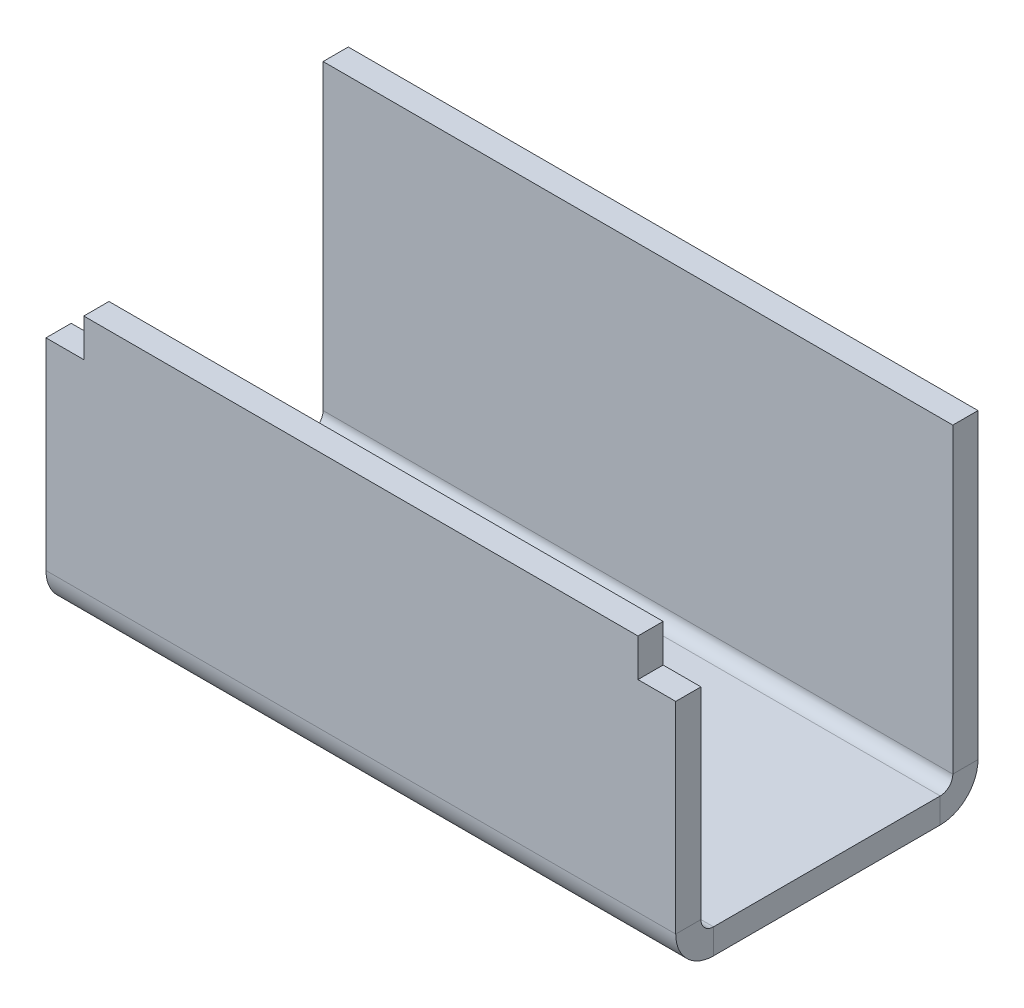
ISO-10303-21;
HEADER;
FILE_DESCRIPTION(('STEP AP214'),'2;1');
FILE_NAME('part.step','',(''),(''),'','','');
FILE_SCHEMA(('AUTOMOTIVE_DESIGN { 1 0 10303 214 1 1 1 1 }'));
ENDSEC;
DATA;
#1=APPLICATION_CONTEXT('core data for automotive mechanical design processes');
#2=APPLICATION_PROTOCOL_DEFINITION('international standard','automotive_design',2000,#1);
#3=PRODUCT_CONTEXT('',#1,'mechanical');
#4=PRODUCT('Part','Part','',(#3));
#5=PRODUCT_RELATED_PRODUCT_CATEGORY('part','',(#4));
#6=PRODUCT_DEFINITION_FORMATION('','',#4);
#7=PRODUCT_DEFINITION_CONTEXT('part definition',#1,'design');
#8=PRODUCT_DEFINITION('design','',#6,#7);
#9=PRODUCT_DEFINITION_SHAPE('','',#8);
#10=(LENGTH_UNIT() NAMED_UNIT(*) SI_UNIT(.MILLI.,.METRE.));
#11=(NAMED_UNIT(*) PLANE_ANGLE_UNIT() SI_UNIT($,.RADIAN.));
#12=(NAMED_UNIT(*) SI_UNIT($,.STERADIAN.) SOLID_ANGLE_UNIT());
#13=UNCERTAINTY_MEASURE_WITH_UNIT(LENGTH_MEASURE(1.E-05),#10,'distance_accuracy_value','');
#14=(GEOMETRIC_REPRESENTATION_CONTEXT(3) GLOBAL_UNCERTAINTY_ASSIGNED_CONTEXT((#13)) GLOBAL_UNIT_ASSIGNED_CONTEXT((#10,
#11,#12)) REPRESENTATION_CONTEXT('',''));
#15=CARTESIAN_POINT('',(0.,0.,0.));
#16=DIRECTION('',(0.,0.,1.));
#17=DIRECTION('',(1.,0.,0.));
#18=AXIS2_PLACEMENT_3D('',#15,#16,#17);
#19=CARTESIAN_POINT('',(4.92013E-12,-0.07421739130408,-0.02));
#20=DIRECTION('',(0.,0.,1.));
#21=DIRECTION('',(0.,-1.,0.));
#22=AXIS2_PLACEMENT_3D('',#19,#20,#21);
#23=PLANE('',#22);
#24=DIRECTION('',(1.,0.,0.));
#25=VECTOR('',#24,1.);
#26=CARTESIAN_POINT('',(-0.249999999995,0.01,-0.02));
#27=LINE('',#26,#25);
#28=CARTESIAN_POINT('',(-0.249999999995,0.01,-0.02));
#29=VERTEX_POINT('',#28);
#30=CARTESIAN_POINT('',(0.250000000005,0.01,-0.02));
#31=VERTEX_POINT('',#30);
#32=EDGE_CURVE('E246',#29,#31,#27,.T.);
#33=ORIENTED_EDGE('',*,*,#32,.F.);
#34=DIRECTION('',(0.,1.,0.));
#35=VECTOR('',#34,1.);
#36=CARTESIAN_POINT('',(-0.249999999995,-0.37,-0.02));
#37=LINE('',#36,#35);
#38=CARTESIAN_POINT('',(-0.249999999995,0.25,-0.02));
#39=VERTEX_POINT('',#38);
#40=EDGE_CURVE('E20',#29,#39,#37,.T.);
#41=ORIENTED_EDGE('',*,*,#40,.T.);
#42=DIRECTION('',(1.,0.,0.));
#43=VECTOR('',#42,1.);
#44=CARTESIAN_POINT('',(-0.249999999995,0.25,-0.02));
#45=LINE('',#44,#43);
#46=CARTESIAN_POINT('',(0.250000000005,0.25,-0.02));
#47=VERTEX_POINT('',#46);
#48=EDGE_CURVE('E11',#39,#47,#45,.T.);
#49=ORIENTED_EDGE('',*,*,#48,.T.);
#50=DIRECTION('',(0.,-1.,0.));
#51=VECTOR('',#50,1.);
#52=CARTESIAN_POINT('',(0.250000000005,0.25,-0.02));
#53=LINE('',#52,#51);
#54=EDGE_CURVE('E254',#47,#31,#53,.T.);
#55=ORIENTED_EDGE('',*,*,#54,.T.);
#56=EDGE_LOOP('',(#33,#41,#49,#55));
#57=FACE_BOUND('',#56,.T.);
#58=ADVANCED_FACE('F17',(#57),#23,.F.);
#59=CARTESIAN_POINT('',(-0.249999999995,0.25,0.));
#60=DIRECTION('',(0.,-1.,0.));
#61=DIRECTION('',(0.,0.,-1.));
#62=AXIS2_PLACEMENT_3D('',#59,#60,#61);
#63=PLANE('',#62);
#64=DIRECTION('',(0.,0.,-1.));
#65=VECTOR('',#64,1.);
#66=CARTESIAN_POINT('',(-0.249999999995,0.25,0.));
#67=LINE('',#66,#65);
#68=CARTESIAN_POINT('',(-0.249999999995,0.25,0.));
#69=VERTEX_POINT('',#68);
#70=EDGE_CURVE('E299',#69,#39,#67,.T.);
#71=ORIENTED_EDGE('',*,*,#70,.F.);
#72=DIRECTION('',(1.,0.,0.));
#73=VECTOR('',#72,1.);
#74=CARTESIAN_POINT('',(-0.249999999995,0.25,0.));
#75=LINE('',#74,#73);
#76=CARTESIAN_POINT('',(0.250000000005,0.25,0.));
#77=VERTEX_POINT('',#76);
#78=EDGE_CURVE('E247',#69,#77,#75,.T.);
#79=ORIENTED_EDGE('',*,*,#78,.T.);
#80=DIRECTION('',(0.,0.,-1.));
#81=VECTOR('',#80,1.);
#82=CARTESIAN_POINT('',(0.250000000005,0.25,0.));
#83=LINE('',#82,#81);
#84=EDGE_CURVE('E257',#77,#47,#83,.T.);
#85=ORIENTED_EDGE('',*,*,#84,.T.);
#86=ORIENTED_EDGE('',*,*,#48,.F.);
#87=EDGE_LOOP('',(#71,#79,#85,#86));
#88=FACE_BOUND('',#87,.T.);
#89=ADVANCED_FACE('F472',(#88),#63,.F.);
#90=CARTESIAN_POINT('',(-0.249999999995,-0.37,0.));
#91=DIRECTION('',(1.,0.,0.));
#92=DIRECTION('',(0.,1.,0.));
#93=AXIS2_PLACEMENT_3D('',#90,#91,#92);
#94=PLANE('',#93);
#95=DIRECTION('',(0.,1.,0.));
#96=VECTOR('',#95,1.);
#97=CARTESIAN_POINT('',(-0.249999999995,-0.37,0.));
#98=LINE('',#97,#96);
#99=CARTESIAN_POINT('',(-0.249999999995,0.01,0.));
#100=VERTEX_POINT('',#99);
#101=EDGE_CURVE('E239',#100,#69,#98,.T.);
#102=ORIENTED_EDGE('',*,*,#101,.T.);
#103=ORIENTED_EDGE('',*,*,#70,.T.);
#104=ORIENTED_EDGE('',*,*,#40,.F.);
#105=DIRECTION('',(0.,0.,-1.));
#106=VECTOR('',#105,1.);
#107=CARTESIAN_POINT('',(-0.249999999995,0.01,0.));
#108=LINE('',#107,#106);
#109=EDGE_CURVE('E281',#100,#29,#108,.T.);
#110=ORIENTED_EDGE('',*,*,#109,.F.);
#111=EDGE_LOOP('',(#102,#103,#104,#110));
#112=FACE_BOUND('',#111,.T.);
#113=ADVANCED_FACE('F309',(#112),#94,.F.);
#114=CARTESIAN_POINT('',(0.250000000005,0.25,0.));
#115=DIRECTION('',(-1.,0.,0.));
#116=DIRECTION('',(0.,0.,1.));
#117=AXIS2_PLACEMENT_3D('',#114,#115,#116);
#118=PLANE('',#117);
#119=DIRECTION('',(0.,-1.,0.));
#120=VECTOR('',#119,1.);
#121=CARTESIAN_POINT('',(0.250000000005,0.25,0.));
#122=LINE('',#121,#120);
#123=CARTESIAN_POINT('',(0.250000000005,0.01,0.));
#124=VERTEX_POINT('',#123);
#125=EDGE_CURVE('E289',#77,#124,#122,.T.);
#126=ORIENTED_EDGE('',*,*,#125,.T.);
#127=DIRECTION('',(0.,0.,-1.));
#128=VECTOR('',#127,1.);
#129=CARTESIAN_POINT('',(0.250000000005,0.01,0.));
#130=LINE('',#129,#128);
#131=EDGE_CURVE('E280',#124,#31,#130,.T.);
#132=ORIENTED_EDGE('',*,*,#131,.T.);
#133=ORIENTED_EDGE('',*,*,#54,.F.);
#134=ORIENTED_EDGE('',*,*,#84,.F.);
#135=EDGE_LOOP('',(#126,#132,#133,#134));
#136=FACE_BOUND('',#135,.T.);
#137=ADVANCED_FACE('F470',(#136),#118,.F.);
#138=CARTESIAN_POINT('',(-0.249999999995,0.01,0.01));
#139=DIRECTION('',(1.,0.,0.));
#140=DIRECTION('',(0.,0.,1.));
#141=AXIS2_PLACEMENT_3D('',#138,#139,#140);
#142=CYLINDRICAL_SURFACE('',#141,0.03);
#143=DIRECTION('',(-1.,0.,0.));
#144=VECTOR('',#143,1.);
#145=CARTESIAN_POINT('',(-0.249999999995,-0.02,0.01));
#146=LINE('',#145,#144);
#147=CARTESIAN_POINT('',(0.250000000005,-0.02,0.01));
#148=VERTEX_POINT('',#147);
#149=CARTESIAN_POINT('',(-0.249999999995,-0.02,0.01));
#150=VERTEX_POINT('',#149);
#151=EDGE_CURVE('E273',#148,#150,#146,.T.);
#152=ORIENTED_EDGE('',*,*,#151,.T.);
#153=CARTESIAN_POINT('',(-0.249999999995,0.00999999999999739,0.00999999999999739));
#154=DIRECTION('',(1.,0.,0.));
#155=DIRECTION('',(0.,0.,-1.));
#156=AXIS2_PLACEMENT_3D('',#153,#154,#155);
#157=CIRCLE('',#156,0.0299999999999974);
#158=EDGE_CURVE('E285',#150,#29,#157,.T.);
#159=ORIENTED_EDGE('',*,*,#158,.T.);
#160=ORIENTED_EDGE('',*,*,#32,.T.);
#161=CARTESIAN_POINT('',(0.250000000005,0.00999999999999742,0.00999999999999739));
#162=DIRECTION('',(-1.,0.,0.));
#163=DIRECTION('',(0.,-1.,0.));
#164=AXIS2_PLACEMENT_3D('',#161,#162,#163);
#165=CIRCLE('',#164,0.0299999999999974);
#166=EDGE_CURVE('E277',#31,#148,#165,.T.);
#167=ORIENTED_EDGE('',*,*,#166,.T.);
#168=EDGE_LOOP('',(#152,#159,#160,#167));
#169=FACE_BOUND('',#168,.T.);
#170=ADVANCED_FACE('F483',(#169),#142,.T.);
#171=CARTESIAN_POINT('',(4.92013E-12,-0.07421739130408,0.));
#172=DIRECTION('',(0.,0.,1.));
#173=DIRECTION('',(0.,-1.,0.));
#174=AXIS2_PLACEMENT_3D('',#171,#172,#173);
#175=PLANE('',#174);
#176=DIRECTION('',(1.,0.,0.));
#177=VECTOR('',#176,1.);
#178=CARTESIAN_POINT('',(-0.249999999995,0.01,0.));
#179=LINE('',#178,#177);
#180=EDGE_CURVE('E238',#100,#124,#179,.T.);
#181=ORIENTED_EDGE('',*,*,#180,.T.);
#182=ORIENTED_EDGE('',*,*,#125,.F.);
#183=ORIENTED_EDGE('',*,*,#78,.F.);
#184=ORIENTED_EDGE('',*,*,#101,.F.);
#185=EDGE_LOOP('',(#181,#182,#183,#184));
#186=FACE_BOUND('',#185,.T.);
#187=ADVANCED_FACE('F471',(#186),#175,.T.);
#188=CARTESIAN_POINT('',(-0.249999999995,0.00293014320761232,0.0029301432076107));
#189=DIRECTION('',(-1.,0.,0.));
#190=DIRECTION('',(0.,0.,1.));
#191=AXIS2_PLACEMENT_3D('',#188,#189,#190);
#192=PLANE('',#191);
#193=CARTESIAN_POINT('',(-0.249999999995,0.,0.01));
#194=CARTESIAN_POINT('',(-0.249999999995,0.,0.009893145140566));
#195=CARTESIAN_POINT('',(-0.249999999995,1.71273217497177E-06,0.00978629333149694));
#196=CARTESIAN_POINT('',(-0.249999999995,5.13767503647344E-06,0.00967948930591211));
#197=CARTESIAN_POINT('',(-0.249999999995,8.5626178979759E-06,0.00957268528032725));
#198=CARTESIAN_POINT('',(-0.249999999995,1.36997278971819E-05,0.00946593514359925));
#199=CARTESIAN_POINT('',(-0.249999999995,2.05460724966439E-05,0.00935929780019276));
#200=CARTESIAN_POINT('',(-0.249999999995,2.73924170960974E-05,0.00925266045678639));
#201=CARTESIAN_POINT('',(-0.249999999995,3.59481483652578E-05,0.00914613285964536));
#202=CARTESIAN_POINT('',(-0.249999999995,4.62088705079945E-05,0.00903976974092342));
#203=CARTESIAN_POINT('',(-0.249999999995,5.64695926507638E-05,0.00893340662220115));
#204=CARTESIAN_POINT('',(-0.249999999995,6.84353056671169E-05,0.00882720798189799));
#205=CARTESIAN_POINT('',(-0.249999999995,8.20998617675744E-05,0.00872122838315467));
#206=CARTESIAN_POINT('',(-0.249999999995,9.57644178679983E-05,0.00861524878441161));
#207=CARTESIAN_POINT('',(-0.249999999995,0.00011112781705252,0.00850948822722841));
#208=CARTESIAN_POINT('',(-0.249999999995,0.000128182165855533,0.00840400104966599));
#209=CARTESIAN_POINT('',(-0.249999999995,0.00016229086346156,0.00819302669454117));
#210=CARTESIAN_POINT('',(-0.249999999995,0.000203165087210005,0.00798314619436319));
#211=CARTESIAN_POINT('',(-0.249999999995,0.000250720878181752,0.00777479066043691));
#212=CARTESIAN_POINT('',(-0.249999999995,0.000274498773667626,0.00767061289347377));
#213=CARTESIAN_POINT('',(-0.249999999995,0.000299946629042216,0.00756681628395764));
#214=CARTESIAN_POINT('',(-0.249999999995,0.000327051369609675,0.00746345416090504));
#215=CARTESIAN_POINT('',(-0.249999999995,0.000354156110177135,0.00736009203785245));
#216=CARTESIAN_POINT('',(-0.249999999995,0.000382917735937458,0.00725716440126338));
#217=CARTESIAN_POINT('',(-0.249999999995,0.000413321469633321,0.00715472413368992));
#218=CARTESIAN_POINT('',(-0.249999999995,0.000443725203329185,0.00705228386611645));
#219=CARTESIAN_POINT('',(-0.249999999995,0.000475771044960588,0.0069503309675586));
#220=CARTESIAN_POINT('',(-0.249999999995,0.000509442529893238,0.00684891781976402));
#221=CARTESIAN_POINT('',(-0.249999999995,0.000543114014825887,0.00674750467196944));
#222=CARTESIAN_POINT('',(-0.249999999995,0.00057841114305978,0.00664663127493813));
#223=CARTESIAN_POINT('',(-0.249999999995,0.000615315779502293,0.0065463494557872));
#224=CARTESIAN_POINT('',(-0.249999999995,0.000652220415944894,0.00644606763663603));
#225=CARTESIAN_POINT('',(-0.249999999995,0.000690732560596126,0.00634637739536524));
#226=CARTESIAN_POINT('',(-0.249999999995,0.000730832426539943,0.00624732995120586));
#227=CARTESIAN_POINT('',(-0.249999999995,0.000770932292483661,0.00614828250704672));
#228=CARTESIAN_POINT('',(-0.249999999995,0.000812619879719954,0.00604987785999899));
#229=CARTESIAN_POINT('',(-0.249999999995,0.000855873769841952,0.00595216656877589));
#230=CARTESIAN_POINT('',(-0.249999999995,0.00089912765996395,0.00585445527755279));
#231=CARTESIAN_POINT('',(-0.249999999995,0.000943947852971657,0.00575743734215433));
#232=CARTESIAN_POINT('',(-0.249999999995,0.000990311320975899,0.00566116260882423));
#233=CARTESIAN_POINT('',(-0.249999999995,0.00103667478898014,0.00556488787549413));
#234=CARTESIAN_POINT('',(-0.249999999995,0.00108458153198091,0.00546935634423239));
#235=CARTESIAN_POINT('',(-0.249999999995,0.0011340069362699,0.00537461709759184));
#236=CARTESIAN_POINT('',(-0.249999999995,0.00118343234055889,0.00527987785095128));
#237=CARTESIAN_POINT('',(-0.249999999995,0.0012343764061361,0.00518593088893193));
#238=CARTESIAN_POINT('',(-0.249999999995,0.00128681295876596,0.00509282447996089));
#239=CARTESIAN_POINT('',(-0.249999999995,0.00133924951139582,0.00499971807098984));
#240=CARTESIAN_POINT('',(-0.249999999995,0.00139317855107833,0.0049074522150671));
#241=CARTESIAN_POINT('',(-0.249999999995,0.00144857236994657,0.0048160743168947));
#242=CARTESIAN_POINT('',(-0.249999999995,0.00150396618881482,0.0047246964187223));
#243=CARTESIAN_POINT('',(-0.249999999995,0.00156082478686879,0.00463420647830025));
#244=CARTESIAN_POINT('',(-0.249999999995,0.00161911895108181,0.00454465098789418));
#245=CARTESIAN_POINT('',(-0.249999999995,0.00167741311529483,0.00445509549748811));
#246=CARTESIAN_POINT('',(-0.249999999995,0.00173714284566688,0.00436647445709802));
#247=CARTESIAN_POINT('',(-0.249999999995,0.00179827745403031,0.00427883339877848));
#248=CARTESIAN_POINT('',(-0.249999999995,0.0018594120623939,0.00419119234045873));
#249=CARTESIAN_POINT('',(-0.249999999995,0.00192195154874889,0.00410453126420954));
#250=CARTESIAN_POINT('',(-0.249999999995,0.00198586378132042,0.00401889469508785));
#251=CARTESIAN_POINT('',(-0.249999999995,0.0020497760138918,0.00393325812596638));
#252=CARTESIAN_POINT('',(-0.249999999995,0.00211506099267971,0.00384864606397241));
#253=CARTESIAN_POINT('',(-0.249999999995,0.00218168517531969,0.00376510198141269));
#254=CARTESIAN_POINT('',(-0.249999999995,0.00224830935795966,0.00368155789885295));
#255=CARTESIAN_POINT('',(-0.249999999995,0.00231627274445171,0.00359908179572746));
#256=CARTESIAN_POINT('',(-0.249999999995,0.00238554041630878,0.00351771604692197));
#257=CARTESIAN_POINT('',(-0.249999999995,0.00245480808816585,0.00343635029811647));
#258=CARTESIAN_POINT('',(-0.249999999995,0.00252538004538794,0.00335609490363096));
#259=CARTESIAN_POINT('',(-0.249999999995,0.00259722002924699,0.00327699109738667));
#260=CARTESIAN_POINT('',(-0.249999999995,0.00266906001310604,0.00319788729114238));
#261=CARTESIAN_POINT('',(-0.249999999995,0.00274216802360205,0.00311993507313931));
#262=CARTESIAN_POINT('',(-0.249999999995,0.00281650649902325,0.0030431744939646));
#263=CARTESIAN_POINT('',(-0.249999999995,0.0028908449744439,0.00296641391479045));
#264=CARTESIAN_POINT('',(-0.249999999995,0.00296641391478971,0.00289084497444464));
#265=CARTESIAN_POINT('',(-0.249999999995,0.00304317449396359,0.00281650649902422));
#266=CARTESIAN_POINT('',(-0.249999999995,0.00311993507313879,0.00274216802360253));
#267=CARTESIAN_POINT('',(-0.249999999995,0.00319788729114211,0.00266906001310627));
#268=CARTESIAN_POINT('',(-0.249999999995,0.00327699109738686,0.00259722002924682));
#269=CARTESIAN_POINT('',(-0.249999999995,0.00335609490363161,0.00252538004538736));
#270=CARTESIAN_POINT('',(-0.249999999995,0.00343635029811778,0.0024548080881647));
#271=CARTESIAN_POINT('',(-0.249999999995,0.00351771604692396,0.00238554041630708));
#272=CARTESIAN_POINT('',(-0.249999999995,0.00359908179572815,0.00231627274445117));
#273=CARTESIAN_POINT('',(-0.249999999995,0.00368155789885228,0.00224830935796023));
#274=CARTESIAN_POINT('',(-0.249999999995,0.00376510198141101,0.00218168517532102));
#275=CARTESIAN_POINT('',(-0.249999999995,0.00384864606397178,0.00211506099268018));
#276=CARTESIAN_POINT('',(-0.249999999995,0.0039332581259672,0.00204977601389115));
#277=CARTESIAN_POINT('',(-0.249999999995,0.00401889469508981,0.00198586378131896));
#278=CARTESIAN_POINT('',(-0.249999999995,0.00410453126421032,0.00192195154874834));
#279=CARTESIAN_POINT('',(-0.249999999995,0.00419119234045796,0.00185941206239448));
#280=CARTESIAN_POINT('',(-0.249999999995,0.00427883339877623,0.00179827745403189));
#281=CARTESIAN_POINT('',(-0.249999999995,0.00436647445709665,0.0017371428456678));
#282=CARTESIAN_POINT('',(-0.249999999995,0.00445509549748777,0.00167741311529504));
#283=CARTESIAN_POINT('',(-0.249999999995,0.00454465098789468,0.00161911895108148));
#284=CARTESIAN_POINT('',(-0.249999999995,0.0046342064783016,0.00156082478686792));
#285=CARTESIAN_POINT('',(-0.249999999995,0.00472469641872432,0.00150396618881355));
#286=CARTESIAN_POINT('',(-0.249999999995,0.00481607431689735,0.00144857236994496));
#287=CARTESIAN_POINT('',(-0.249999999995,0.00490745221506815,0.00139317855107772));
#288=CARTESIAN_POINT('',(-0.249999999995,0.00499971807098923,0.00133924951139618));
#289=CARTESIAN_POINT('',(-0.249999999995,0.00509282447995906,0.00128681295876699));
#290=CARTESIAN_POINT('',(-0.249999999995,0.00518593088893116,0.00123437640613651));
#291=CARTESIAN_POINT('',(-0.249999999995,0.00527987785095204,0.00118343234055847));
#292=CARTESIAN_POINT('',(-0.249999999995,0.0053746170975939,0.00113400693626882));
#293=CARTESIAN_POINT('',(-0.249999999995,0.00546935634423343,0.00108458153198039));
#294=CARTESIAN_POINT('',(-0.249999999995,0.0055648878754939,0.00103667478898028));
#295=CARTESIAN_POINT('',(-0.249999999995,0.00566116260882242,0.000990311320976772));
#296=CARTESIAN_POINT('',(-0.249999999995,0.0057574373421533,0.000943947852972129));
#297=CARTESIAN_POINT('',(-0.249999999995,0.00585445527755229,0.000899127659964166));
#298=CARTESIAN_POINT('',(-0.249999999995,0.0059521665687761,0.000855873769841859));
#299=CARTESIAN_POINT('',(-0.249999999995,0.0060498778599999,0.000812619879719553));
#300=CARTESIAN_POINT('',(-0.249999999995,0.00614828250704853,0.000770932292482897));
#301=CARTESIAN_POINT('',(-0.249999999995,0.00624732995120857,0.000730832426538847));
#302=CARTESIAN_POINT('',(-0.249999999995,0.00634637739536618,0.00069073256059578));
#303=CARTESIAN_POINT('',(-0.249999999995,0.00644606763663518,0.000652220415945242));
#304=CARTESIAN_POINT('',(-0.249999999995,0.00654634945578453,0.000615315779503276));
#305=CARTESIAN_POINT('',(-0.249999999995,0.00664663127493634,0.000578411143060407));
#306=CARTESIAN_POINT('',(-0.249999999995,0.00674750467196854,0.000543114014826186));
#307=CARTESIAN_POINT('',(-0.249999999995,0.00684891781976399,0.000509442529893248));
#308=CARTESIAN_POINT('',(-0.249999999995,0.00695033096755943,0.000475771044960313));
#309=CARTESIAN_POINT('',(-0.249999999995,0.00705228386611812,0.000443725203328662));
#310=CARTESIAN_POINT('',(-0.249999999995,0.00715472413369243,0.000413321469632577));
#311=CARTESIAN_POINT('',(-0.249999999995,0.00725716440126422,0.000382917735937237));
#312=CARTESIAN_POINT('',(-0.249999999995,0.00736009203785161,0.000354156110177378));
#313=CARTESIAN_POINT('',(-0.249999999995,0.00746345416090294,0.000327051369610228));
#314=CARTESIAN_POINT('',(-0.249999999995,0.0075668162839568,0.000299946629042414));
#315=CARTESIAN_POINT('',(-0.249999999995,0.00767061289347463,0.000274498773667405));
#316=CARTESIAN_POINT('',(-0.249999999995,0.00777479066043905,0.000250720878181262));
#317=CARTESIAN_POINT('',(-0.249999999995,0.00787896842740093,0.000226942982695701));
#318=CARTESIAN_POINT('',(-0.249999999995,0.00798352735180936,0.000204835047098909));
#319=CARTESIAN_POINT('',(-0.249999999995,0.00808841371298352,0.000184408430089883));
#320=CARTESIAN_POINT('',(-0.249999999995,0.00819330007416025,0.000163981813080356));
#321=CARTESIAN_POINT('',(-0.249999999995,0.00829851387210272,0.000145236514658685));
#322=CARTESIAN_POINT('',(-0.249999999995,0.00840400104966604,0.000128182165855526));
#323=CARTESIAN_POINT('',(-0.249999999995,0.00850948822722936,0.000111127817052367));
#324=CARTESIAN_POINT('',(-0.249999999995,0.00861524878441351,9.57644178677224E-05));
#325=CARTESIAN_POINT('',(-0.249999999995,0.00872122838315751,8.20998617672083E-05));
#326=CARTESIAN_POINT('',(-0.249999999995,0.00882720798189891,6.84353056670288E-05));
#327=CARTESIAN_POINT('',(-0.249999999995,0.00893340662220015,5.64695926508876E-05));
#328=CARTESIAN_POINT('',(-0.249999999995,0.00903976974092092,4.62088705082356E-05));
#329=CARTESIAN_POINT('',(-0.249999999995,0.0091461328596443,3.59481483653326E-05));
#330=CARTESIAN_POINT('',(-0.249999999995,0.00925266045678724,2.73924170960174E-05));
#331=CARTESIAN_POINT('',(-0.249999999995,0.00935929780019519,2.05460724964877E-05));
#332=CARTESIAN_POINT('',(-0.249999999995,0.00946593514360054,1.3699727897126E-05));
#333=CARTESIAN_POINT('',(-0.249999999995,0.00957268528032707,8.56261789800169E-06));
#334=CARTESIAN_POINT('',(-0.249999999995,0.00967948930591028,5.13767503653242E-06));
#335=CARTESIAN_POINT('',(-0.249999999995,0.00978629333149611,1.71273217497933E-06));
#336=CARTESIAN_POINT('',(-0.249999999995,0.009893145140566,0.));
#337=CARTESIAN_POINT('',(-0.249999999995,0.01,0.));
#338=(BOUNDED_CURVE() B_SPLINE_CURVE(3,(#193,#194,#195,#196,#197,#198,#199,#200,#201,#202,#203,
#204,#205,#206,#207,#208,#209,#210,#211,#212,#213,#214,#215,#216,#217,#218,#219,#220,#221,#222,
#223,#224,#225,#226,#227,#228,#229,#230,#231,#232,#233,#234,#235,#236,#237,#238,#239,#240,#241,
#242,#243,#244,#245,#246,#247,#248,#249,#250,#251,#252,#253,#254,#255,#256,#257,#258,#259,#260,
#261,#262,#263,#264,#265,#266,#267,#268,#269,#270,#271,#272,#273,#274,#275,#276,#277,#278,#279,
#280,#281,#282,#283,#284,#285,#286,#287,#288,#289,#290,#291,#292,#293,#294,#295,#296,#297,#298,
#299,#300,#301,#302,#303,#304,#305,#306,#307,#308,#309,#310,#311,#312,#313,#314,#315,#316,#317,
#318,#319,#320,#321,#322,#323,#324,#325,#326,#327,#328,#329,#330,#331,#332,#333,#334,#335,#336,
#337),.UNSPECIFIED.,.F.,.F.) B_SPLINE_CURVE_WITH_KNOTS((4,3,3,3,3,3,3,3,3,3,3,3,3,3,3,3,3,3,3,3,
3,3,3,3,3,3,3,3,3,3,3,3,3,3,3,3,3,3,3,3,3,3,3,3,3,3,3,3,4),(0.,0.0004081632653061,
0.0008163265306123,0.001224489795918,0.001632653061225,0.002040816326531,0.002857142857143,
0.003265306122449,0.003673469387755,0.004081632653061,0.004489795918367,0.004897959183674,
0.00530612244898,0.005714285714286,0.006122448979592,0.006530612244898,0.006938775510204,
0.00734693877551,0.007755102040816,0.008163265306123,0.008571428571429,0.008979591836735,
0.009387755102041,0.009795918367347,0.01020408163265,0.01061224489796,0.01102040816327,
0.01142857142857,0.01183673469388,0.01224489795918,0.01265306122449,0.0130612244898,
0.0134693877551,0.01387755102041,0.01428571428571,0.01469387755102,0.01510204081633,
0.01551020408163,0.01591836734694,0.01632653061225,0.01673469387755,0.01714285714286,
0.01755102040816,0.01795918367347,0.01836734693878,0.01877551020408,0.01918367346939,
0.01959183673469,0.02),
.UNSPECIFIED.) CURVE() GEOMETRIC_REPRESENTATION_ITEM() RATIONAL_B_SPLINE_CURVE((1.,1.,1.,1.,1.,
1.,1.,1.,1.,1.,1.,1.,1.,1.,1.,1.,1.,1.,1.,1.,1.,1.,1.,1.,1.,1.,1.,1.,1.,1.,1.,1.,1.,1.,1.,1.,1.,
1.,1.,1.,1.,1.,1.,1.,1.,1.,1.,1.,1.,1.,1.,1.,1.,1.,1.,1.,1.,1.,1.,1.,1.,1.,1.,1.,1.,1.,1.,1.,1.,
1.,1.,1.,1.,1.,1.,1.,1.,1.,1.,1.,1.,1.,1.,1.,1.,1.,1.,1.,1.,1.,1.,1.,1.,1.,1.,1.,1.,1.,1.,1.,1.,
1.,1.,1.,1.,1.,1.,1.,1.,1.,1.,1.,1.,1.,1.,1.,1.,1.,1.,1.,1.,1.,1.,1.,1.,1.,1.,1.,1.,1.,1.,1.,1.,
1.,1.,1.,1.,1.,1.,1.,1.,1.,1.,1.,1.)) REPRESENTATION_ITEM(''));
#339=CARTESIAN_POINT('',(-0.249999999995,0.,0.01));
#340=VERTEX_POINT('',#339);
#341=EDGE_CURVE('E231',#340,#100,#338,.T.);
#342=ORIENTED_EDGE('',*,*,#341,.T.);
#343=ORIENTED_EDGE('',*,*,#109,.T.);
#344=ORIENTED_EDGE('',*,*,#158,.F.);
#345=DIRECTION('',(0.,-1.,0.));
#346=VECTOR('',#345,1.);
#347=CARTESIAN_POINT('',(-0.249999999995,0.,0.01));
#348=LINE('',#347,#346);
#349=EDGE_CURVE('E225',#340,#150,#348,.T.);
#350=ORIENTED_EDGE('',*,*,#349,.F.);
#351=EDGE_LOOP('',(#342,#343,#344,#350));
#352=FACE_BOUND('',#351,.T.);
#353=ADVANCED_FACE('F314',(#352),#192,.T.);
#354=CARTESIAN_POINT('',(0.250000000005,0.0029301432076107,0.00293014320761232));
#355=DIRECTION('',(1.,0.,0.));
#356=DIRECTION('',(0.,-1.,0.));
#357=AXIS2_PLACEMENT_3D('',#354,#355,#356);
#358=PLANE('',#357);
#359=CARTESIAN_POINT('',(0.250000000005,0.01,0.));
#360=CARTESIAN_POINT('',(0.250000000005,0.00859286338199755,0.));
#361=CARTESIAN_POINT('',(0.250000000005,0.00718641173617944,0.000301349067827812));
#362=CARTESIAN_POINT('',(0.250000000005,0.0059027824444477,0.000877894524701326));
#363=CARTESIAN_POINT('',(0.250000000005,0.00462172035620145,0.00145328691540849));
#364=CARTESIAN_POINT('',(0.250000000005,0.00346429423329071,0.00230215961333946));
#365=CARTESIAN_POINT('',(0.250000000005,0.00253056070535886,0.00335112967311959));
#366=CARTESIAN_POINT('',(0.250000000005,0.00226846605203303,0.00364557068433206));
#367=CARTESIAN_POINT('',(0.250000000005,0.00202380255708488,0.0039555262044016));
#368=CARTESIAN_POINT('',(0.250000000005,0.00179827745403189,0.00427883339877623));
#369=CARTESIAN_POINT('',(0.250000000005,0.0017371428456678,0.00436647445709665));
#370=CARTESIAN_POINT('',(0.250000000005,0.00167741311529504,0.00445509549748777));
#371=CARTESIAN_POINT('',(0.250000000005,0.00161911895108148,0.00454465098789469));
#372=CARTESIAN_POINT('',(0.250000000005,0.00156082478686792,0.0046342064783016));
#373=CARTESIAN_POINT('',(0.250000000005,0.00150396618881355,0.00472469641872432));
#374=CARTESIAN_POINT('',(0.250000000005,0.00144857236994496,0.00481607431689736));
#375=CARTESIAN_POINT('',(0.250000000005,0.0012823909133419,0.00509020801141198));
#376=CARTESIAN_POINT('',(0.250000000005,0.00112940172498842,0.00537233840883451));
#377=CARTESIAN_POINT('',(0.250000000005,0.000990311320976758,0.00566116260882245));
#378=CARTESIAN_POINT('',(0.250000000005,0.000943947852972115,0.00575743734215333));
#379=CARTESIAN_POINT('',(0.250000000005,0.000899127659964162,0.0058544552775523));
#380=CARTESIAN_POINT('',(0.250000000005,0.000855873769841857,0.0059521665687761));
#381=CARTESIAN_POINT('',(0.250000000005,0.000812619879719552,0.0060498778599999));
#382=CARTESIAN_POINT('',(0.250000000005,0.000770932292482897,0.00614828250704853));
#383=CARTESIAN_POINT('',(0.250000000005,0.000730832426538847,0.00624732995120857));
#384=CARTESIAN_POINT('',(0.250000000005,0.000690732560595782,0.00634637739536618));
#385=CARTESIAN_POINT('',(0.250000000005,0.000652220415945244,0.00644606763663518));
#386=CARTESIAN_POINT('',(0.250000000005,0.000615315779503278,0.00654634945578453));
#387=CARTESIAN_POINT('',(0.250000000005,0.000578411143060407,0.00664663127493634));
#388=CARTESIAN_POINT('',(0.250000000005,0.000543114014826185,0.00674750467196854));
#389=CARTESIAN_POINT('',(0.250000000005,0.00050944252989325,0.00684891781976398));
#390=CARTESIAN_POINT('',(0.250000000005,0.000475771044960313,0.00695033096755943));
#391=CARTESIAN_POINT('',(0.250000000005,0.000443725203328663,0.00705228386611812));
#392=CARTESIAN_POINT('',(0.250000000005,0.000413321469632579,0.00715472413369242));
#393=CARTESIAN_POINT('',(0.250000000005,0.000139687866370792,0.00807668654185115));
#394=CARTESIAN_POINT('',(0.250000000005,0.,0.00903830626510447));
#395=CARTESIAN_POINT('',(0.250000000005,0.,0.01));
#396=(BOUNDED_CURVE() B_SPLINE_CURVE(3,(#359,#360,#361,#362,#363,#364,#365,#366,#367,#368,#369,
#370,#371,#372,#373,#374,#375,#376,#377,#378,#379,#380,#381,#382,#383,#384,#385,#386,#387,#388,
#389,#390,#391,#392,#393,#394,#395),.UNSPECIFIED.,.F.,.F.) B_SPLINE_CURVE_WITH_KNOTS((4,3,3,3,3,
3,3,3,3,3,3,3,4),(0.,0.0053749682492486,0.0107391867927116,0.01224489795918,0.01265306122449,
0.0130612244898,0.01428571428571,0.01469387755102,0.01510204081633,0.01551020408163,
0.01591836734694,0.01632653061225,0.02),
.UNSPECIFIED.) CURVE() GEOMETRIC_REPRESENTATION_ITEM() RATIONAL_B_SPLINE_CURVE((1.,1.,1.,1.,1.,
1.,1.,1.,1.,1.,1.,1.,1.,1.,1.,1.,1.,1.,1.,1.,1.,1.,1.,1.,1.,1.,1.,1.,1.,1.,1.,1.,1.,1.,1.,1.,1.)) REPRESENTATION_ITEM(''));
#397=CARTESIAN_POINT('',(0.250000000005,0.,0.01));
#398=VERTEX_POINT('',#397);
#399=EDGE_CURVE('E230',#124,#398,#396,.T.);
#400=ORIENTED_EDGE('',*,*,#399,.T.);
#401=DIRECTION('',(0.,-1.,0.));
#402=VECTOR('',#401,1.);
#403=CARTESIAN_POINT('',(0.250000000005,0.,0.01));
#404=LINE('',#403,#402);
#405=EDGE_CURVE('E218',#398,#148,#404,.T.);
#406=ORIENTED_EDGE('',*,*,#405,.T.);
#407=ORIENTED_EDGE('',*,*,#166,.F.);
#408=ORIENTED_EDGE('',*,*,#131,.F.);
#409=EDGE_LOOP('',(#400,#406,#407,#408));
#410=FACE_BOUND('',#409,.T.);
#411=ADVANCED_FACE('F466',(#410),#358,.T.);
#412=CARTESIAN_POINT('',(4.92013E-12,-0.02,0.07421739130408));
#413=DIRECTION('',(0.,1.,0.));
#414=DIRECTION('',(0.,0.,-1.));
#415=AXIS2_PLACEMENT_3D('',#412,#413,#414);
#416=PLANE('',#415);
#417=DIRECTION('',(1.,0.,0.));
#418=VECTOR('',#417,1.);
#419=CARTESIAN_POINT('',(0.250000000005,-0.02,0.19));
#420=LINE('',#419,#418);
#421=CARTESIAN_POINT('',(-0.249999999995,-0.02,0.19));
#422=VERTEX_POINT('',#421);
#423=CARTESIAN_POINT('',(0.250000000005,-0.02,0.19));
#424=VERTEX_POINT('',#423);
#425=EDGE_CURVE('E211',#422,#424,#420,.T.);
#426=ORIENTED_EDGE('',*,*,#425,.F.);
#427=DIRECTION('',(0.,0.,-1.));
#428=VECTOR('',#427,1.);
#429=CARTESIAN_POINT('',(-0.249999999995,-0.02,0.37));
#430=LINE('',#429,#428);
#431=EDGE_CURVE('E226',#422,#150,#430,.T.);
#432=ORIENTED_EDGE('',*,*,#431,.T.);
#433=ORIENTED_EDGE('',*,*,#151,.F.);
#434=DIRECTION('',(0.,0.,1.));
#435=VECTOR('',#434,1.);
#436=CARTESIAN_POINT('',(0.250000000005,-0.02,-0.25));
#437=LINE('',#436,#435);
#438=EDGE_CURVE('E215',#148,#424,#437,.T.);
#439=ORIENTED_EDGE('',*,*,#438,.T.);
#440=EDGE_LOOP('',(#426,#432,#433,#439));
#441=FACE_BOUND('',#440,.T.);
#442=ADVANCED_FACE('F493',(#441),#416,.F.);
#443=CARTESIAN_POINT('',(4.92013E-12,-0.125782608696,0.22));
#444=DIRECTION('',(0.,0.,-1.));
#445=DIRECTION('',(-1.,0.,0.));
#446=AXIS2_PLACEMENT_3D('',#443,#444,#445);
#447=PLANE('',#446);
#448=DIRECTION('',(-1.,0.,0.));
#449=VECTOR('',#448,1.);
#450=CARTESIAN_POINT('',(0.219999999995,0.2,0.22));
#451=LINE('',#450,#449);
#452=CARTESIAN_POINT('',(0.219999999995,0.2,0.22));
#453=VERTEX_POINT('',#452);
#454=CARTESIAN_POINT('',(-0.219999999995,0.2,0.22));
#455=VERTEX_POINT('',#454);
#456=EDGE_CURVE('E176',#453,#455,#451,.T.);
#457=ORIENTED_EDGE('',*,*,#456,.T.);
#458=DIRECTION('',(0.,-1.,0.));
#459=VECTOR('',#458,1.);
#460=CARTESIAN_POINT('',(-0.219999999995,0.2,0.22));
#461=LINE('',#460,#459);
#462=CARTESIAN_POINT('',(-0.219999999995,0.17,0.22));
#463=VERTEX_POINT('',#462);
#464=EDGE_CURVE('E175',#455,#463,#461,.T.);
#465=ORIENTED_EDGE('',*,*,#464,.T.);
#466=DIRECTION('',(-1.,0.,0.));
#467=VECTOR('',#466,1.);
#468=CARTESIAN_POINT('',(-0.219999999995,0.17,0.22));
#469=LINE('',#468,#467);
#470=CARTESIAN_POINT('',(-0.249999999995,0.17,0.22));
#471=VERTEX_POINT('',#470);
#472=EDGE_CURVE('E171',#463,#471,#469,.T.);
#473=ORIENTED_EDGE('',*,*,#472,.T.);
#474=DIRECTION('',(0.,-1.,0.));
#475=VECTOR('',#474,1.);
#476=CARTESIAN_POINT('',(-0.249999999995,0.17,0.22));
#477=LINE('',#476,#475);
#478=CARTESIAN_POINT('',(-0.249999999995,0.01,0.22));
#479=VERTEX_POINT('',#478);
#480=EDGE_CURVE('E237',#471,#479,#477,.T.);
#481=ORIENTED_EDGE('',*,*,#480,.T.);
#482=DIRECTION('',(-1.,0.,0.));
#483=VECTOR('',#482,1.);
#484=CARTESIAN_POINT('',(0.250000000005,0.01,0.22));
#485=LINE('',#484,#483);
#486=CARTESIAN_POINT('',(0.250000000005,0.01,0.22));
#487=VERTEX_POINT('',#486);
#488=EDGE_CURVE('E207',#487,#479,#485,.T.);
#489=ORIENTED_EDGE('',*,*,#488,.F.);
#490=DIRECTION('',(0.,1.,0.));
#491=VECTOR('',#490,1.);
#492=CARTESIAN_POINT('',(0.250000000005,-0.45,0.22));
#493=LINE('',#492,#491);
#494=CARTESIAN_POINT('',(0.250000000005,0.16999999999,0.22));
#495=VERTEX_POINT('',#494);
#496=EDGE_CURVE('E203',#487,#495,#493,.T.);
#497=ORIENTED_EDGE('',*,*,#496,.T.);
#498=DIRECTION('',(1.,0.,0.));
#499=VECTOR('',#498,1.);
#500=CARTESIAN_POINT('',(0.219999999995,0.16999999999,0.22));
#501=LINE('',#500,#499);
#502=CARTESIAN_POINT('',(0.219999999995,0.16999999999,0.22));
#503=VERTEX_POINT('',#502);
#504=EDGE_CURVE('E267',#503,#495,#501,.T.);
#505=ORIENTED_EDGE('',*,*,#504,.F.);
#506=DIRECTION('',(0.,-1.,0.));
#507=VECTOR('',#506,1.);
#508=CARTESIAN_POINT('',(0.219999999995,0.2,0.22));
#509=LINE('',#508,#507);
#510=EDGE_CURVE('E270',#453,#503,#509,.T.);
#511=ORIENTED_EDGE('',*,*,#510,.F.);
#512=EDGE_LOOP('',(#457,#465,#473,#481,#489,#497,#505,#511));
#513=FACE_BOUND('',#512,.T.);
#514=ADVANCED_FACE('F436',(#513),#447,.F.);
#515=CARTESIAN_POINT('',(0.219999999995,0.2,0.2));
#516=DIRECTION('',(1.,0.,0.));
#517=DIRECTION('',(0.,1.,0.));
#518=AXIS2_PLACEMENT_3D('',#515,#516,#517);
#519=PLANE('',#518);
#520=DIRECTION('',(0.,0.,1.));
#521=VECTOR('',#520,1.);
#522=CARTESIAN_POINT('',(0.219999999995,0.2,0.2));
#523=LINE('',#522,#521);
#524=CARTESIAN_POINT('',(0.219999999995,0.2,0.2));
#525=VERTEX_POINT('',#524);
#526=EDGE_CURVE('E253',#525,#453,#523,.T.);
#527=ORIENTED_EDGE('',*,*,#526,.T.);
#528=ORIENTED_EDGE('',*,*,#510,.T.);
#529=DIRECTION('',(0.,0.,1.));
#530=VECTOR('',#529,1.);
#531=CARTESIAN_POINT('',(0.219999999995,0.16999999999,0.2));
#532=LINE('',#531,#530);
#533=CARTESIAN_POINT('',(0.219999999995,0.16999999999,0.2));
#534=VERTEX_POINT('',#533);
#535=EDGE_CURVE('E263',#534,#503,#532,.T.);
#536=ORIENTED_EDGE('',*,*,#535,.F.);
#537=DIRECTION('',(0.,-1.,0.));
#538=VECTOR('',#537,1.);
#539=CARTESIAN_POINT('',(0.219999999995,0.2,0.2));
#540=LINE('',#539,#538);
#541=EDGE_CURVE('E341',#525,#534,#540,.T.);
#542=ORIENTED_EDGE('',*,*,#541,.F.);
#543=EDGE_LOOP('',(#527,#528,#536,#542));
#544=FACE_BOUND('',#543,.T.);
#545=ADVANCED_FACE('F431',(#544),#519,.T.);
#546=CARTESIAN_POINT('',(0.219999999995,0.16999999999,0.2));
#547=DIRECTION('',(0.,1.,0.));
#548=DIRECTION('',(1.,0.,0.));
#549=AXIS2_PLACEMENT_3D('',#546,#547,#548);
#550=PLANE('',#549);
#551=ORIENTED_EDGE('',*,*,#535,.T.);
#552=ORIENTED_EDGE('',*,*,#504,.T.);
#553=DIRECTION('',(0.,0.,1.));
#554=VECTOR('',#553,1.);
#555=CARTESIAN_POINT('',(0.250000000005,0.16999999999,0.2));
#556=LINE('',#555,#554);
#557=CARTESIAN_POINT('',(0.250000000005,0.16999999999,0.2));
#558=VERTEX_POINT('',#557);
#559=EDGE_CURVE('E187',#558,#495,#556,.T.);
#560=ORIENTED_EDGE('',*,*,#559,.F.);
#561=DIRECTION('',(1.,0.,0.));
#562=VECTOR('',#561,1.);
#563=CARTESIAN_POINT('',(0.219999999995,0.16999999999,0.2));
#564=LINE('',#563,#562);
#565=EDGE_CURVE('E348',#534,#558,#564,.T.);
#566=ORIENTED_EDGE('',*,*,#565,.F.);
#567=EDGE_LOOP('',(#551,#552,#560,#566));
#568=FACE_BOUND('',#567,.T.);
#569=ADVANCED_FACE('F434',(#568),#550,.T.);
#570=CARTESIAN_POINT('',(-0.219999999995,0.17,0.2));
#571=DIRECTION('',(0.,-1.,0.));
#572=DIRECTION('',(0.,0.,-1.));
#573=AXIS2_PLACEMENT_3D('',#570,#571,#572);
#574=PLANE('',#573);
#575=DIRECTION('',(0.,0.,1.));
#576=VECTOR('',#575,1.);
#577=CARTESIAN_POINT('',(-0.219999999995,0.17,0.2));
#578=LINE('',#577,#576);
#579=CARTESIAN_POINT('',(-0.219999999995,0.17,0.2));
#580=VERTEX_POINT('',#579);
#581=EDGE_CURVE('E164',#580,#463,#578,.T.);
#582=ORIENTED_EDGE('',*,*,#581,.F.);
#583=DIRECTION('',(-1.,0.,0.));
#584=VECTOR('',#583,1.);
#585=CARTESIAN_POINT('',(-0.219999999995,0.17,0.2));
#586=LINE('',#585,#584);
#587=CARTESIAN_POINT('',(-0.249999999995,0.17,0.2));
#588=VERTEX_POINT('',#587);
#589=EDGE_CURVE('E169',#580,#588,#586,.T.);
#590=ORIENTED_EDGE('',*,*,#589,.T.);
#591=DIRECTION('',(0.,0.,1.));
#592=VECTOR('',#591,1.);
#593=CARTESIAN_POINT('',(-0.249999999995,0.17,0.2));
#594=LINE('',#593,#592);
#595=EDGE_CURVE('E250',#588,#471,#594,.T.);
#596=ORIENTED_EDGE('',*,*,#595,.T.);
#597=ORIENTED_EDGE('',*,*,#472,.F.);
#598=EDGE_LOOP('',(#582,#590,#596,#597));
#599=FACE_BOUND('',#598,.T.);
#600=ADVANCED_FACE('F166',(#599),#574,.F.);
#601=CARTESIAN_POINT('',(-0.219999999995,0.2,0.2));
#602=DIRECTION('',(1.,0.,0.));
#603=DIRECTION('',(0.,1.,0.));
#604=AXIS2_PLACEMENT_3D('',#601,#602,#603);
#605=PLANE('',#604);
#606=DIRECTION('',(0.,0.,1.));
#607=VECTOR('',#606,1.);
#608=CARTESIAN_POINT('',(-0.219999999995,0.2,0.2));
#609=LINE('',#608,#607);
#610=CARTESIAN_POINT('',(-0.219999999995,0.2,0.2));
#611=VERTEX_POINT('',#610);
#612=EDGE_CURVE('E182',#611,#455,#609,.T.);
#613=ORIENTED_EDGE('',*,*,#612,.F.);
#614=DIRECTION('',(0.,-1.,0.));
#615=VECTOR('',#614,1.);
#616=CARTESIAN_POINT('',(-0.219999999995,0.2,0.2));
#617=LINE('',#616,#615);
#618=EDGE_CURVE('E179',#611,#580,#617,.T.);
#619=ORIENTED_EDGE('',*,*,#618,.T.);
#620=ORIENTED_EDGE('',*,*,#581,.T.);
#621=ORIENTED_EDGE('',*,*,#464,.F.);
#622=EDGE_LOOP('',(#613,#619,#620,#621));
#623=FACE_BOUND('',#622,.T.);
#624=ADVANCED_FACE('F180',(#623),#605,.F.);
#625=CARTESIAN_POINT('',(0.219999999995,0.2,0.2));
#626=DIRECTION('',(0.,-1.,0.));
#627=DIRECTION('',(0.,0.,-1.));
#628=AXIS2_PLACEMENT_3D('',#625,#626,#627);
#629=PLANE('',#628);
#630=ORIENTED_EDGE('',*,*,#526,.F.);
#631=DIRECTION('',(-1.,0.,0.));
#632=VECTOR('',#631,1.);
#633=CARTESIAN_POINT('',(0.219999999995,0.2,0.2));
#634=LINE('',#633,#632);
#635=EDGE_CURVE('E349',#525,#611,#634,.T.);
#636=ORIENTED_EDGE('',*,*,#635,.T.);
#637=ORIENTED_EDGE('',*,*,#612,.T.);
#638=ORIENTED_EDGE('',*,*,#456,.F.);
#639=EDGE_LOOP('',(#630,#636,#637,#638));
#640=FACE_BOUND('',#639,.T.);
#641=ADVANCED_FACE('F427',(#640),#629,.F.);
#642=CARTESIAN_POINT('',(-0.249999999995,0.17,0.2));
#643=DIRECTION('',(1.,0.,0.));
#644=DIRECTION('',(0.,1.,0.));
#645=AXIS2_PLACEMENT_3D('',#642,#643,#644);
#646=PLANE('',#645);
#647=DIRECTION('',(0.,-1.,0.));
#648=VECTOR('',#647,1.);
#649=CARTESIAN_POINT('',(-0.249999999995,0.17,0.2));
#650=LINE('',#649,#648);
#651=CARTESIAN_POINT('',(-0.249999999995,0.01,0.2));
#652=VERTEX_POINT('',#651);
#653=EDGE_CURVE('E191',#588,#652,#650,.T.);
#654=ORIENTED_EDGE('',*,*,#653,.T.);
#655=DIRECTION('',(0.,0.,1.));
#656=VECTOR('',#655,1.);
#657=CARTESIAN_POINT('',(-0.249999999995,0.01,0.2));
#658=LINE('',#657,#656);
#659=EDGE_CURVE('E358',#652,#479,#658,.T.);
#660=ORIENTED_EDGE('',*,*,#659,.T.);
#661=ORIENTED_EDGE('',*,*,#480,.F.);
#662=ORIENTED_EDGE('',*,*,#595,.F.);
#663=EDGE_LOOP('',(#654,#660,#661,#662));
#664=FACE_BOUND('',#663,.T.);
#665=ADVANCED_FACE('F439',(#664),#646,.F.);
#666=CARTESIAN_POINT('',(-0.249999999995,0.01,0.01));
#667=DIRECTION('',(1.,0.,0.));
#668=DIRECTION('',(0.,0.,1.));
#669=AXIS2_PLACEMENT_3D('',#666,#667,#668);
#670=CYLINDRICAL_SURFACE('',#669,0.01);
#671=DIRECTION('',(-1.,0.,0.));
#672=VECTOR('',#671,1.);
#673=CARTESIAN_POINT('',(-0.249999999995,0.,0.01));
#674=LINE('',#673,#672);
#675=EDGE_CURVE('E350',#398,#340,#674,.T.);
#676=ORIENTED_EDGE('',*,*,#675,.F.);
#677=ORIENTED_EDGE('',*,*,#399,.F.);
#678=ORIENTED_EDGE('',*,*,#180,.F.);
#679=ORIENTED_EDGE('',*,*,#341,.F.);
#680=EDGE_LOOP('',(#676,#677,#678,#679));
#681=FACE_BOUND('',#680,.T.);
#682=ADVANCED_FACE('F321',(#681),#670,.F.);
#683=CARTESIAN_POINT('',(-0.249999999995,0.,0.37));
#684=DIRECTION('',(1.,0.,0.));
#685=DIRECTION('',(0.,1.,0.));
#686=AXIS2_PLACEMENT_3D('',#683,#684,#685);
#687=PLANE('',#686);
#688=DIRECTION('',(0.,0.,-1.));
#689=VECTOR('',#688,1.);
#690=CARTESIAN_POINT('',(-0.249999999995,0.,0.37));
#691=LINE('',#690,#689);
#692=CARTESIAN_POINT('',(-0.249999999995,0.,0.19));
#693=VERTEX_POINT('',#692);
#694=EDGE_CURVE('E354',#693,#340,#691,.T.);
#695=ORIENTED_EDGE('',*,*,#694,.T.);
#696=ORIENTED_EDGE('',*,*,#349,.T.);
#697=ORIENTED_EDGE('',*,*,#431,.F.);
#698=DIRECTION('',(0.,-1.,0.));
#699=VECTOR('',#698,1.);
#700=CARTESIAN_POINT('',(-0.249999999995,0.,0.19));
#701=LINE('',#700,#699);
#702=EDGE_CURVE('E356',#693,#422,#701,.T.);
#703=ORIENTED_EDGE('',*,*,#702,.F.);
#704=EDGE_LOOP('',(#695,#696,#697,#703));
#705=FACE_BOUND('',#704,.T.);
#706=ADVANCED_FACE('F444',(#705),#687,.F.);
#707=CARTESIAN_POINT('',(0.250000000005,0.,-0.25));
#708=DIRECTION('',(-1.,0.,0.));
#709=DIRECTION('',(0.,0.,1.));
#710=AXIS2_PLACEMENT_3D('',#707,#708,#709);
#711=PLANE('',#710);
#712=DIRECTION('',(0.,0.,1.));
#713=VECTOR('',#712,1.);
#714=CARTESIAN_POINT('',(0.250000000005,0.,-0.25));
#715=LINE('',#714,#713);
#716=CARTESIAN_POINT('',(0.250000000005,0.,0.19));
#717=VERTEX_POINT('',#716);
#718=EDGE_CURVE('E336',#398,#717,#715,.T.);
#719=ORIENTED_EDGE('',*,*,#718,.T.);
#720=DIRECTION('',(0.,-1.,0.));
#721=VECTOR('',#720,1.);
#722=CARTESIAN_POINT('',(0.250000000005,0.,0.19));
#723=LINE('',#722,#721);
#724=EDGE_CURVE('E334',#717,#424,#723,.T.);
#725=ORIENTED_EDGE('',*,*,#724,.T.);
#726=ORIENTED_EDGE('',*,*,#438,.F.);
#727=ORIENTED_EDGE('',*,*,#405,.F.);
#728=EDGE_LOOP('',(#719,#725,#726,#727));
#729=FACE_BOUND('',#728,.T.);
#730=ADVANCED_FACE('F462',(#729),#711,.F.);
#731=CARTESIAN_POINT('',(0.250000000005,0.01,0.19));
#732=DIRECTION('',(-1.,0.,0.));
#733=DIRECTION('',(0.,0.,-1.));
#734=AXIS2_PLACEMENT_3D('',#731,#732,#733);
#735=CYLINDRICAL_SURFACE('',#734,0.03);
#736=CARTESIAN_POINT('',(0.250000000005,0.01,0.19));
#737=DIRECTION('',(-1.,0.,0.));
#738=DIRECTION('',(0.,-1.,0.));
#739=AXIS2_PLACEMENT_3D('',#736,#737,#738);
#740=CIRCLE('',#739,0.03);
#741=EDGE_CURVE('E337',#424,#487,#740,.T.);
#742=ORIENTED_EDGE('',*,*,#741,.T.);
#743=ORIENTED_EDGE('',*,*,#488,.T.);
#744=CARTESIAN_POINT('',(-0.249999999995,0.01,0.19));
#745=DIRECTION('',(1.,0.,0.));
#746=DIRECTION('',(0.,0.,1.));
#747=AXIS2_PLACEMENT_3D('',#744,#745,#746);
#748=CIRCLE('',#747,0.03);
#749=EDGE_CURVE('E361',#479,#422,#748,.T.);
#750=ORIENTED_EDGE('',*,*,#749,.T.);
#751=ORIENTED_EDGE('',*,*,#425,.T.);
#752=EDGE_LOOP('',(#742,#743,#750,#751));
#753=FACE_BOUND('',#752,.T.);
#754=ADVANCED_FACE('F390',(#753),#735,.T.);
#755=CARTESIAN_POINT('',(0.250000000005,-0.45,0.2));
#756=DIRECTION('',(-1.,0.,0.));
#757=DIRECTION('',(0.,0.,1.));
#758=AXIS2_PLACEMENT_3D('',#755,#756,#757);
#759=PLANE('',#758);
#760=DIRECTION('',(0.,1.,0.));
#761=VECTOR('',#760,1.);
#762=CARTESIAN_POINT('',(0.250000000005,-0.45,0.2));
#763=LINE('',#762,#761);
#764=CARTESIAN_POINT('',(0.250000000005,0.01,0.2));
#765=VERTEX_POINT('',#764);
#766=EDGE_CURVE('E197',#765,#558,#763,.T.);
#767=ORIENTED_EDGE('',*,*,#766,.T.);
#768=ORIENTED_EDGE('',*,*,#559,.T.);
#769=ORIENTED_EDGE('',*,*,#496,.F.);
#770=DIRECTION('',(0.,0.,1.));
#771=VECTOR('',#770,1.);
#772=CARTESIAN_POINT('',(0.250000000005,0.01,0.2));
#773=LINE('',#772,#771);
#774=EDGE_CURVE('E382',#765,#487,#773,.T.);
#775=ORIENTED_EDGE('',*,*,#774,.F.);
#776=EDGE_LOOP('',(#767,#768,#769,#775));
#777=FACE_BOUND('',#776,.T.);
#778=ADVANCED_FACE('F400',(#777),#759,.F.);
#779=CARTESIAN_POINT('',(4.92013E-12,-0.125782608696,0.2));
#780=DIRECTION('',(0.,0.,-1.));
#781=DIRECTION('',(-1.,0.,0.));
#782=AXIS2_PLACEMENT_3D('',#779,#780,#781);
#783=PLANE('',#782);
#784=ORIENTED_EDGE('',*,*,#635,.F.);
#785=ORIENTED_EDGE('',*,*,#541,.T.);
#786=ORIENTED_EDGE('',*,*,#565,.T.);
#787=ORIENTED_EDGE('',*,*,#766,.F.);
#788=DIRECTION('',(-1.,0.,0.));
#789=VECTOR('',#788,1.);
#790=CARTESIAN_POINT('',(0.250000000005,0.01,0.2));
#791=LINE('',#790,#789);
#792=EDGE_CURVE('E376',#765,#652,#791,.T.);
#793=ORIENTED_EDGE('',*,*,#792,.T.);
#794=ORIENTED_EDGE('',*,*,#653,.F.);
#795=ORIENTED_EDGE('',*,*,#589,.F.);
#796=ORIENTED_EDGE('',*,*,#618,.F.);
#797=EDGE_LOOP('',(#784,#785,#786,#787,#793,#794,#795,#796));
#798=FACE_BOUND('',#797,.T.);
#799=ADVANCED_FACE('F189',(#798),#783,.T.);
#800=CARTESIAN_POINT('',(-0.249999999995,0.00292893257189514,0.197071067428016));
#801=DIRECTION('',(-1.,0.,0.));
#802=DIRECTION('',(0.,0.,1.));
#803=AXIS2_PLACEMENT_3D('',#800,#801,#802);
#804=PLANE('',#803);
#805=CARTESIAN_POINT('',(-0.249999999995,0.01,0.19));
#806=DIRECTION('',(1.,0.,0.));
#807=DIRECTION('',(0.,0.,1.));
#808=AXIS2_PLACEMENT_3D('',#805,#806,#807);
#809=CIRCLE('',#808,0.01);
#810=EDGE_CURVE('E406',#652,#693,#809,.T.);
#811=ORIENTED_EDGE('',*,*,#810,.T.);
#812=ORIENTED_EDGE('',*,*,#702,.T.);
#813=ORIENTED_EDGE('',*,*,#749,.F.);
#814=ORIENTED_EDGE('',*,*,#659,.F.);
#815=EDGE_LOOP('',(#811,#812,#813,#814));
#816=FACE_BOUND('',#815,.T.);
#817=ADVANCED_FACE('F441',(#816),#804,.T.);
#818=CARTESIAN_POINT('',(4.92013E-12,0.,0.07421739130408));
#819=DIRECTION('',(0.,1.,0.));
#820=DIRECTION('',(0.,0.,-1.));
#821=AXIS2_PLACEMENT_3D('',#818,#819,#820);
#822=PLANE('',#821);
#823=DIRECTION('',(1.,0.,0.));
#824=VECTOR('',#823,1.);
#825=CARTESIAN_POINT('',(0.250000000005,0.,0.19));
#826=LINE('',#825,#824);
#827=EDGE_CURVE('E410',#693,#717,#826,.T.);
#828=ORIENTED_EDGE('',*,*,#827,.T.);
#829=ORIENTED_EDGE('',*,*,#718,.F.);
#830=ORIENTED_EDGE('',*,*,#675,.T.);
#831=ORIENTED_EDGE('',*,*,#694,.F.);
#832=EDGE_LOOP('',(#828,#829,#830,#831));
#833=FACE_BOUND('',#832,.T.);
#834=ADVANCED_FACE('F446',(#833),#822,.T.);
#835=CARTESIAN_POINT('',(0.250000000005,0.00292893257189514,0.197071067428016));
#836=DIRECTION('',(1.,0.,0.));
#837=DIRECTION('',(0.,1.,0.));
#838=AXIS2_PLACEMENT_3D('',#835,#836,#837);
#839=PLANE('',#838);
#840=CARTESIAN_POINT('',(0.250000000005,0.01,0.19));
#841=DIRECTION('',(-1.,0.,0.));
#842=DIRECTION('',(0.,-1.,0.));
#843=AXIS2_PLACEMENT_3D('',#840,#841,#842);
#844=CIRCLE('',#843,0.01);
#845=EDGE_CURVE('E397',#717,#765,#844,.T.);
#846=ORIENTED_EDGE('',*,*,#845,.T.);
#847=ORIENTED_EDGE('',*,*,#774,.T.);
#848=ORIENTED_EDGE('',*,*,#741,.F.);
#849=ORIENTED_EDGE('',*,*,#724,.F.);
#850=EDGE_LOOP('',(#846,#847,#848,#849));
#851=FACE_BOUND('',#850,.T.);
#852=ADVANCED_FACE('F395',(#851),#839,.T.);
#853=CARTESIAN_POINT('',(0.250000000005,0.01,0.19));
#854=DIRECTION('',(-1.,0.,0.));
#855=DIRECTION('',(0.,0.,-1.));
#856=AXIS2_PLACEMENT_3D('',#853,#854,#855);
#857=CYLINDRICAL_SURFACE('',#856,0.01);
#858=ORIENTED_EDGE('',*,*,#845,.F.);
#859=ORIENTED_EDGE('',*,*,#827,.F.);
#860=ORIENTED_EDGE('',*,*,#810,.F.);
#861=ORIENTED_EDGE('',*,*,#792,.F.);
#862=EDGE_LOOP('',(#858,#859,#860,#861));
#863=FACE_BOUND('',#862,.T.);
#864=ADVANCED_FACE('F403',(#863),#857,.F.);
#865=CLOSED_SHELL('',(#58,#89,#113,#137,#170,#187,#353,#411,#442,#514,#545,#569,#600,#624,#641,
#665,#682,#706,#730,#754,#778,#799,#817,#834,#852,#864));
#866=MANIFOLD_SOLID_BREP('B1',#865);
#867=ADVANCED_BREP_SHAPE_REPRESENTATION('',(#18,#866),#14);
#868=SHAPE_DEFINITION_REPRESENTATION(#9,#867);
ENDSEC;
END-ISO-10303-21;
